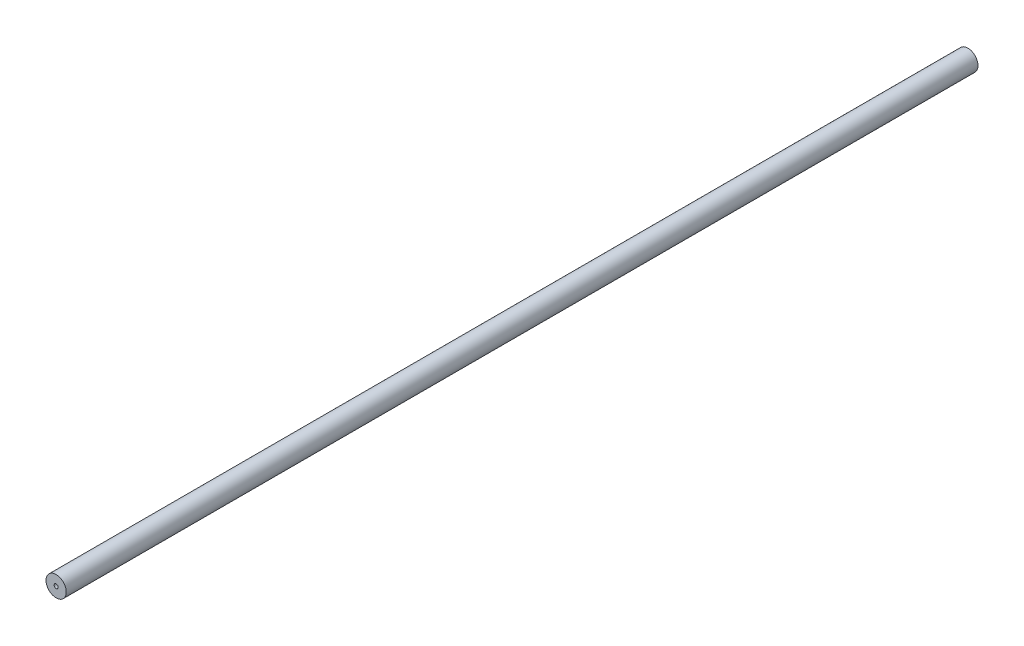
ISO-10303-21;
HEADER;
FILE_DESCRIPTION(('STEP AP214'),'2;1');
FILE_NAME('part.step','',(''),(''),'','','');
FILE_SCHEMA(('AUTOMOTIVE_DESIGN { 1 0 10303 214 1 1 1 1 }'));
ENDSEC;
DATA;
#1=APPLICATION_CONTEXT('core data for automotive mechanical design processes');
#2=APPLICATION_PROTOCOL_DEFINITION('international standard','automotive_design',2000,#1);
#3=PRODUCT_CONTEXT('',#1,'mechanical');
#4=PRODUCT('Part','Part','',(#3));
#5=PRODUCT_RELATED_PRODUCT_CATEGORY('part','',(#4));
#6=PRODUCT_DEFINITION_FORMATION('','',#4);
#7=PRODUCT_DEFINITION_CONTEXT('part definition',#1,'design');
#8=PRODUCT_DEFINITION('design','',#6,#7);
#9=PRODUCT_DEFINITION_SHAPE('','',#8);
#10=(LENGTH_UNIT() NAMED_UNIT(*) SI_UNIT(.MILLI.,.METRE.));
#11=(NAMED_UNIT(*) PLANE_ANGLE_UNIT() SI_UNIT($,.RADIAN.));
#12=(NAMED_UNIT(*) SI_UNIT($,.STERADIAN.) SOLID_ANGLE_UNIT());
#13=UNCERTAINTY_MEASURE_WITH_UNIT(LENGTH_MEASURE(1.E-05),#10,'distance_accuracy_value','');
#14=(GEOMETRIC_REPRESENTATION_CONTEXT(3) GLOBAL_UNCERTAINTY_ASSIGNED_CONTEXT((#13)) GLOBAL_UNIT_ASSIGNED_CONTEXT((#10,
#11,#12)) REPRESENTATION_CONTEXT('',''));
#15=CARTESIAN_POINT('',(0.,0.,0.));
#16=DIRECTION('',(0.,0.,1.));
#17=DIRECTION('',(1.,0.,0.));
#18=AXIS2_PLACEMENT_3D('',#15,#16,#17);
#19=CARTESIAN_POINT('',(0.,0.,180.));
#20=DIRECTION('',(0.,0.,1.));
#21=DIRECTION('',(1.,0.,0.));
#22=AXIS2_PLACEMENT_3D('',#19,#20,#21);
#23=PLANE('',#22);
#24=CARTESIAN_POINT('',(0.,0.,180.));
#25=DIRECTION('',(0.,0.,1.));
#26=DIRECTION('',(1.,0.,0.));
#27=AXIS2_PLACEMENT_3D('',#24,#25,#26);
#28=CIRCLE('',#27,2.);
#29=CARTESIAN_POINT('',(-2.,0.,180.));
#30=VERTEX_POINT('',#29);
#31=EDGE_CURVE('E10',#30,#30,#28,.T.);
#32=ORIENTED_EDGE('',*,*,#31,.T.);
#33=EDGE_LOOP('',(#32));
#34=FACE_BOUND('',#33,.T.);
#35=CARTESIAN_POINT('',(0.,0.,180.));
#36=DIRECTION('',(0.,0.,1.));
#37=DIRECTION('',(1.,0.,0.));
#38=AXIS2_PLACEMENT_3D('',#35,#36,#37);
#39=CIRCLE('',#38,0.399999999999999);
#40=CARTESIAN_POINT('',(0.399999999999999,0.,180.));
#41=VERTEX_POINT('',#40);
#42=EDGE_CURVE('E50',#41,#41,#39,.T.);
#43=ORIENTED_EDGE('',*,*,#42,.F.);
#44=EDGE_LOOP('',(#43));
#45=FACE_BOUND('',#44,.T.);
#46=ADVANCED_FACE('F37',(#34,#45),#23,.T.);
#47=CARTESIAN_POINT('',(0.,0.,0.));
#48=DIRECTION('',(0.,0.,1.));
#49=DIRECTION('',(1.,0.,0.));
#50=AXIS2_PLACEMENT_3D('',#47,#48,#49);
#51=PLANE('',#50);
#52=CARTESIAN_POINT('',(0.,0.,0.));
#53=DIRECTION('',(0.,0.,1.));
#54=DIRECTION('',(1.,0.,0.));
#55=AXIS2_PLACEMENT_3D('',#52,#53,#54);
#56=CIRCLE('',#55,2.);
#57=CARTESIAN_POINT('',(-2.,0.,0.));
#58=VERTEX_POINT('',#57);
#59=EDGE_CURVE('E41',#58,#58,#56,.T.);
#60=ORIENTED_EDGE('',*,*,#59,.F.);
#61=EDGE_LOOP('',(#60));
#62=FACE_BOUND('',#61,.T.);
#63=CARTESIAN_POINT('',(0.,0.,0.));
#64=DIRECTION('',(0.,0.,1.));
#65=DIRECTION('',(1.,0.,0.));
#66=AXIS2_PLACEMENT_3D('',#63,#64,#65);
#67=CIRCLE('',#66,0.399999999999999);
#68=CARTESIAN_POINT('',(0.399999999999999,0.,0.));
#69=VERTEX_POINT('',#68);
#70=EDGE_CURVE('E52',#69,#69,#67,.T.);
#71=ORIENTED_EDGE('',*,*,#70,.T.);
#72=EDGE_LOOP('',(#71));
#73=FACE_BOUND('',#72,.T.);
#74=ADVANCED_FACE('F64',(#62,#73),#51,.F.);
#75=CARTESIAN_POINT('',(0.,0.,180.));
#76=DIRECTION('',(0.,0.,-1.));
#77=DIRECTION('',(-1.,0.,0.));
#78=AXIS2_PLACEMENT_3D('',#75,#76,#77);
#79=CYLINDRICAL_SURFACE('',#78,2.);
#80=CARTESIAN_POINT('',(-2.,0.,180.));
#81=CARTESIAN_POINT('',(-2.,0.,178.125));
#82=CARTESIAN_POINT('',(-2.,0.,176.25));
#83=CARTESIAN_POINT('',(-2.,0.,172.5));
#84=CARTESIAN_POINT('',(-2.,0.,170.625));
#85=CARTESIAN_POINT('',(-2.,0.,166.875));
#86=CARTESIAN_POINT('',(-2.,0.,165.));
#87=CARTESIAN_POINT('',(-2.,0.,161.25));
#88=CARTESIAN_POINT('',(-2.,0.,159.375));
#89=CARTESIAN_POINT('',(-2.,0.,155.625));
#90=CARTESIAN_POINT('',(-2.,0.,153.75));
#91=CARTESIAN_POINT('',(-2.,0.,150.));
#92=CARTESIAN_POINT('',(-2.,0.,148.125));
#93=CARTESIAN_POINT('',(-2.,0.,144.375));
#94=CARTESIAN_POINT('',(-2.,0.,142.5));
#95=CARTESIAN_POINT('',(-2.,0.,138.75));
#96=CARTESIAN_POINT('',(-2.,0.,136.875));
#97=CARTESIAN_POINT('',(-2.,0.,133.125));
#98=CARTESIAN_POINT('',(-2.,0.,131.25));
#99=CARTESIAN_POINT('',(-2.,0.,127.5));
#100=CARTESIAN_POINT('',(-2.,0.,125.625));
#101=CARTESIAN_POINT('',(-2.,0.,121.875));
#102=CARTESIAN_POINT('',(-2.,0.,120.));
#103=CARTESIAN_POINT('',(-2.,0.,116.25));
#104=CARTESIAN_POINT('',(-2.,0.,114.375));
#105=CARTESIAN_POINT('',(-2.,0.,110.625));
#106=CARTESIAN_POINT('',(-2.,0.,108.75));
#107=CARTESIAN_POINT('',(-2.,0.,105.));
#108=CARTESIAN_POINT('',(-2.,0.,103.125));
#109=CARTESIAN_POINT('',(-2.,0.,99.375));
#110=CARTESIAN_POINT('',(-2.,0.,97.5));
#111=CARTESIAN_POINT('',(-2.,0.,93.75));
#112=CARTESIAN_POINT('',(-2.,0.,91.875));
#113=CARTESIAN_POINT('',(-2.,0.,88.125));
#114=CARTESIAN_POINT('',(-2.,0.,86.25));
#115=CARTESIAN_POINT('',(-2.,0.,82.5));
#116=CARTESIAN_POINT('',(-2.,0.,80.625));
#117=CARTESIAN_POINT('',(-2.,0.,76.875));
#118=CARTESIAN_POINT('',(-2.,0.,75.));
#119=CARTESIAN_POINT('',(-2.,0.,71.25));
#120=CARTESIAN_POINT('',(-2.,0.,69.375));
#121=CARTESIAN_POINT('',(-2.,0.,65.625));
#122=CARTESIAN_POINT('',(-2.,0.,63.75));
#123=CARTESIAN_POINT('',(-2.,0.,60.));
#124=CARTESIAN_POINT('',(-2.,0.,58.125));
#125=CARTESIAN_POINT('',(-2.,0.,54.375));
#126=CARTESIAN_POINT('',(-2.,0.,52.5));
#127=CARTESIAN_POINT('',(-2.,0.,48.75));
#128=CARTESIAN_POINT('',(-2.,0.,46.875));
#129=CARTESIAN_POINT('',(-2.,0.,43.125));
#130=CARTESIAN_POINT('',(-2.,0.,41.25));
#131=CARTESIAN_POINT('',(-2.,0.,37.5));
#132=CARTESIAN_POINT('',(-2.,0.,35.625));
#133=CARTESIAN_POINT('',(-2.,0.,31.875));
#134=CARTESIAN_POINT('',(-2.,0.,30.));
#135=CARTESIAN_POINT('',(-2.,0.,26.25));
#136=CARTESIAN_POINT('',(-2.,0.,24.375));
#137=CARTESIAN_POINT('',(-2.,0.,20.625));
#138=CARTESIAN_POINT('',(-2.,0.,18.75));
#139=CARTESIAN_POINT('',(-2.,0.,15.));
#140=CARTESIAN_POINT('',(-2.,0.,13.125));
#141=CARTESIAN_POINT('',(-2.,0.,9.37499999999998));
#142=CARTESIAN_POINT('',(-2.,0.,7.49999999999997));
#143=CARTESIAN_POINT('',(-2.,0.,3.74999999999997));
#144=CARTESIAN_POINT('',(-2.,0.,1.87499999999997));
#145=CARTESIAN_POINT('',(-2.,0.,0.));
#146=B_SPLINE_CURVE_WITH_KNOTS('',3,(#80,#81,#82,#83,#84,#85,#86,#87,#88,#89,#90,#91,#92,#93,
#94,#95,#96,#97,#98,#99,#100,#101,#102,#103,#104,#105,#106,#107,#108,#109,#110,#111,#112,#113,
#114,#115,#116,#117,#118,#119,#120,#121,#122,#123,#124,#125,#126,#127,#128,#129,#130,#131,#132,
#133,#134,#135,#136,#137,#138,#139,#140,#141,#142,#143,#144,#145),.UNSPECIFIED.,.F.,.F.,(4,2,2,
2,2,2,2,2,2,2,2,2,2,2,2,2,2,2,2,2,2,2,2,2,2,2,2,2,2,2,2,2,4),(0.,5.62500000000002,11.25,16.875,
22.5,28.125,33.75,39.375,45.,50.625,56.25,61.875,67.5,73.125,78.75,84.375,90.,95.625,101.25,
106.875,112.5,118.125,123.75,129.375,135.,140.625,146.25,151.875,157.5,163.125,168.75,174.375,
180.),.UNSPECIFIED.);
#147=EDGE_CURVE('BSEAM39',#30,#58,#146,.T.);
#148=ORIENTED_EDGE('',*,*,#31,.F.);
#149=ORIENTED_EDGE('',*,*,#59,.T.);
#150=ORIENTED_EDGE('',*,*,#147,.T.);
#151=ORIENTED_EDGE('',*,*,#147,.F.);
#152=EDGE_LOOP('',(#148,#150,#149,#151));
#153=FACE_BOUND('',#152,.T.);
#154=ADVANCED_FACE('F39',(#153),#79,.T.);
#155=CARTESIAN_POINT('',(0.,0.,180.));
#156=DIRECTION('',(0.,0.,-1.));
#157=DIRECTION('',(-1.,0.,0.));
#158=AXIS2_PLACEMENT_3D('',#155,#156,#157);
#159=CYLINDRICAL_SURFACE('',#158,0.399999999999999);
#160=ORIENTED_EDGE('',*,*,#42,.T.);
#161=EDGE_LOOP('',(#160));
#162=FACE_BOUND('',#161,.T.);
#163=ORIENTED_EDGE('',*,*,#70,.F.);
#164=EDGE_LOOP('',(#163));
#165=FACE_BOUND('',#164,.T.);
#166=ADVANCED_FACE('F60',(#162,#165),#159,.F.);
#167=CLOSED_SHELL('',(#46,#74,#154,#166));
#168=MANIFOLD_SOLID_BREP('B2',#167);
#169=ADVANCED_BREP_SHAPE_REPRESENTATION('',(#18,#168),#14);
#170=SHAPE_DEFINITION_REPRESENTATION(#9,#169);
ENDSEC;
END-ISO-10303-21;
